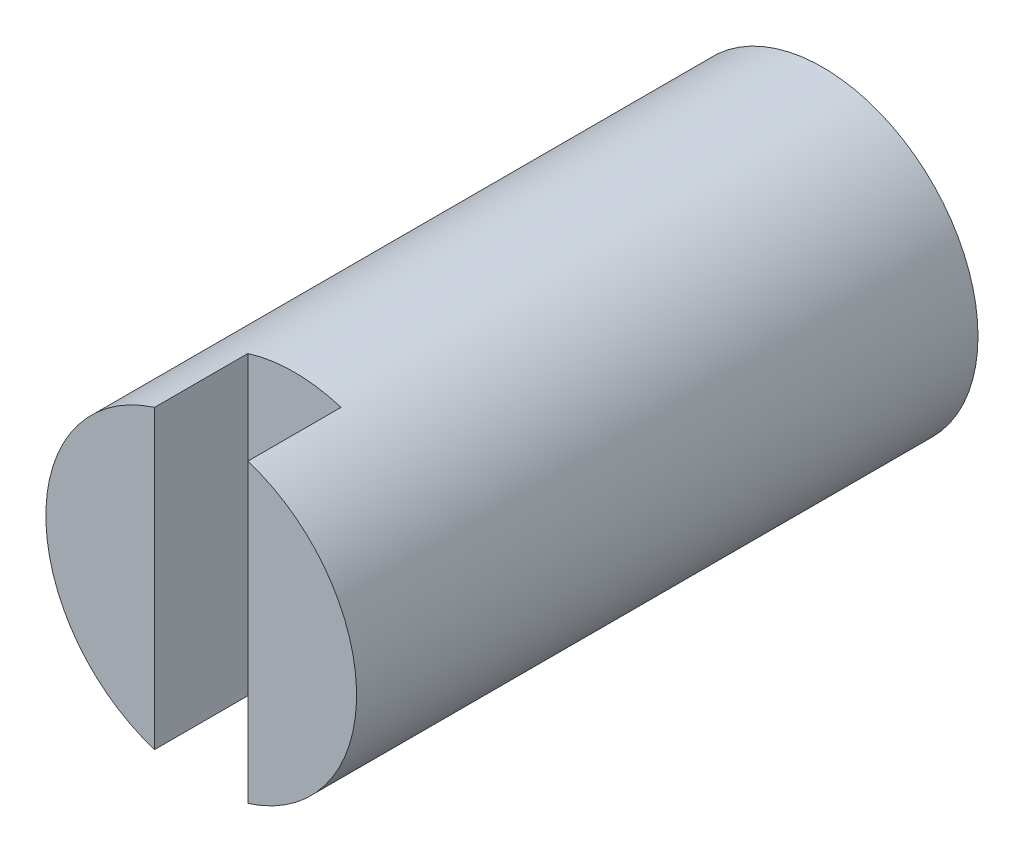
ISO-10303-21;
HEADER;
FILE_DESCRIPTION(('STEP AP214'),'2;1');
FILE_NAME('part.step','',(''),(''),'','','');
FILE_SCHEMA(('AUTOMOTIVE_DESIGN { 1 0 10303 214 1 1 1 1 }'));
ENDSEC;
DATA;
#1=APPLICATION_CONTEXT('core data for automotive mechanical design processes');
#2=APPLICATION_PROTOCOL_DEFINITION('international standard','automotive_design',2000,#1);
#3=PRODUCT_CONTEXT('',#1,'mechanical');
#4=PRODUCT('Part','Part','',(#3));
#5=PRODUCT_RELATED_PRODUCT_CATEGORY('part','',(#4));
#6=PRODUCT_DEFINITION_FORMATION('','',#4);
#7=PRODUCT_DEFINITION_CONTEXT('part definition',#1,'design');
#8=PRODUCT_DEFINITION('design','',#6,#7);
#9=PRODUCT_DEFINITION_SHAPE('','',#8);
#10=(LENGTH_UNIT() NAMED_UNIT(*) SI_UNIT(.MILLI.,.METRE.));
#11=(NAMED_UNIT(*) PLANE_ANGLE_UNIT() SI_UNIT($,.RADIAN.));
#12=(NAMED_UNIT(*) SI_UNIT($,.STERADIAN.) SOLID_ANGLE_UNIT());
#13=UNCERTAINTY_MEASURE_WITH_UNIT(LENGTH_MEASURE(1.E-05),#10,'distance_accuracy_value','');
#14=(GEOMETRIC_REPRESENTATION_CONTEXT(3) GLOBAL_UNCERTAINTY_ASSIGNED_CONTEXT((#13)) GLOBAL_UNIT_ASSIGNED_CONTEXT((#10,
#11,#12)) REPRESENTATION_CONTEXT('',''));
#15=CARTESIAN_POINT('',(0.,0.,0.));
#16=DIRECTION('',(0.,0.,1.));
#17=DIRECTION('',(1.,0.,0.));
#18=AXIS2_PLACEMENT_3D('',#15,#16,#17);
#19=CARTESIAN_POINT('',(0.,0.,8.));
#20=DIRECTION('',(0.,0.,1.));
#21=DIRECTION('',(1.,0.,0.));
#22=AXIS2_PLACEMENT_3D('',#19,#20,#21);
#23=PLANE('',#22);
#24=DIRECTION('',(0.,-1.,0.));
#25=VECTOR('',#24,1.);
#26=CARTESIAN_POINT('',(-0.599999999999999,0.,8.));
#27=LINE('',#26,#25);
#28=CARTESIAN_POINT('',(-0.6,1.90787840283389,8.));
#29=VERTEX_POINT('',#28);
#30=CARTESIAN_POINT('',(-0.599999999999999,-1.90787840283389,8.));
#31=VERTEX_POINT('',#30);
#32=EDGE_CURVE('E80',#29,#31,#27,.T.);
#33=ORIENTED_EDGE('',*,*,#32,.F.);
#34=CARTESIAN_POINT('',(0.,0.,8.));
#35=DIRECTION('',(0.,0.,1.));
#36=DIRECTION('',(1.,0.,0.));
#37=AXIS2_PLACEMENT_3D('',#34,#35,#36);
#38=CIRCLE('',#37,2.);
#39=EDGE_CURVE('E81',#29,#31,#38,.T.);
#40=ORIENTED_EDGE('',*,*,#39,.T.);
#41=EDGE_LOOP('',(#33,#40));
#42=FACE_BOUND('',#41,.T.);
#43=ADVANCED_FACE('F33',(#42),#23,.T.);
#44=CARTESIAN_POINT('',(0.,0.,8.));
#45=DIRECTION('',(0.,0.,-1.));
#46=DIRECTION('',(-1.,0.,0.));
#47=AXIS2_PLACEMENT_3D('',#44,#45,#46);
#48=CYLINDRICAL_SURFACE('',#47,2.);
#49=ORIENTED_EDGE('',*,*,#39,.F.);
#50=DIRECTION('',(0.,0.,-1.));
#51=VECTOR('',#50,1.);
#52=CARTESIAN_POINT('',(-0.6,1.90787840283389,8.));
#53=LINE('',#52,#51);
#54=CARTESIAN_POINT('',(-0.6,1.90787840283389,6.8));
#55=VERTEX_POINT('',#54);
#56=EDGE_CURVE('E96',#29,#55,#53,.T.);
#57=ORIENTED_EDGE('',*,*,#56,.T.);
#58=CARTESIAN_POINT('',(0.,0.,6.8));
#59=DIRECTION('',(0.,0.,1.));
#60=DIRECTION('',(1.,0.,0.));
#61=AXIS2_PLACEMENT_3D('',#58,#59,#60);
#62=CIRCLE('',#61,2.);
#63=CARTESIAN_POINT('',(0.6,1.90787840283389,6.8));
#64=VERTEX_POINT('',#63);
#65=EDGE_CURVE('E11',#64,#55,#62,.T.);
#66=ORIENTED_EDGE('',*,*,#65,.F.);
#67=DIRECTION('',(0.,0.,-1.));
#68=VECTOR('',#67,1.);
#69=CARTESIAN_POINT('',(0.6,1.90787840283389,8.));
#70=LINE('',#69,#68);
#71=CARTESIAN_POINT('',(0.6,1.90787840283389,8.));
#72=VERTEX_POINT('',#71);
#73=EDGE_CURVE('E75',#64,#72,#70,.F.);
#74=ORIENTED_EDGE('',*,*,#73,.T.);
#75=CARTESIAN_POINT('',(0.6,-1.90787840283389,8.));
#76=VERTEX_POINT('',#75);
#77=EDGE_CURVE('E87',#76,#72,#38,.T.);
#78=ORIENTED_EDGE('',*,*,#77,.F.);
#79=DIRECTION('',(0.,0.,-1.));
#80=VECTOR('',#79,1.);
#81=CARTESIAN_POINT('',(0.6,-1.90787840283389,8.));
#82=LINE('',#81,#80);
#83=CARTESIAN_POINT('',(0.6,-1.90787840283389,6.8));
#84=VERTEX_POINT('',#83);
#85=EDGE_CURVE('E48',#76,#84,#82,.T.);
#86=ORIENTED_EDGE('',*,*,#85,.T.);
#87=CARTESIAN_POINT('',(-0.599999999999999,-1.90787840283389,6.8));
#88=VERTEX_POINT('',#87);
#89=EDGE_CURVE('E37',#88,#84,#62,.T.);
#90=ORIENTED_EDGE('',*,*,#89,.F.);
#91=DIRECTION('',(0.,0.,-1.));
#92=VECTOR('',#91,1.);
#93=CARTESIAN_POINT('',(-0.599999999999999,-1.90787840283389,8.));
#94=LINE('',#93,#92);
#95=EDGE_CURVE('E56',#88,#31,#94,.F.);
#96=ORIENTED_EDGE('',*,*,#95,.T.);
#97=EDGE_LOOP('',(#49,#57,#66,#74,#78,#86,#90,#96));
#98=FACE_BOUND('',#97,.T.);
#99=CARTESIAN_POINT('',(0.,0.,0.));
#100=DIRECTION('',(0.,0.,1.));
#101=DIRECTION('',(1.,0.,0.));
#102=AXIS2_PLACEMENT_3D('',#99,#100,#101);
#103=CIRCLE('',#102,2.);
#104=CARTESIAN_POINT('',(2.,0.,0.));
#105=VERTEX_POINT('',#104);
#106=EDGE_CURVE('E92',#105,#105,#103,.T.);
#107=ORIENTED_EDGE('',*,*,#106,.T.);
#108=EDGE_LOOP('',(#107));
#109=FACE_BOUND('',#108,.T.);
#110=ADVANCED_FACE('F35',(#98,#109),#48,.T.);
#111=DIRECTION('',(0.,1.,0.));
#112=VECTOR('',#111,1.);
#113=CARTESIAN_POINT('',(0.6,0.,8.));
#114=LINE('',#113,#112);
#115=EDGE_CURVE('E72',#76,#72,#114,.T.);
#116=ORIENTED_EDGE('',*,*,#115,.F.);
#117=ORIENTED_EDGE('',*,*,#77,.T.);
#118=EDGE_LOOP('',(#116,#117));
#119=FACE_BOUND('',#118,.T.);
#120=ADVANCED_FACE('F91',(#119),#23,.T.);
#121=CARTESIAN_POINT('',(0.,0.,0.));
#122=DIRECTION('',(0.,0.,1.));
#123=DIRECTION('',(1.,0.,0.));
#124=AXIS2_PLACEMENT_3D('',#121,#122,#123);
#125=PLANE('',#124);
#126=ORIENTED_EDGE('',*,*,#106,.F.);
#127=EDGE_LOOP('',(#126));
#128=FACE_BOUND('',#127,.T.);
#129=ADVANCED_FACE('F115',(#128),#125,.F.);
#130=CARTESIAN_POINT('',(-0.599999999999999,-2.20900076277647,6.8));
#131=DIRECTION('',(0.,0.,1.));
#132=DIRECTION('',(1.,0.,0.));
#133=AXIS2_PLACEMENT_3D('',#130,#131,#132);
#134=PLANE('',#133);
#135=ORIENTED_EDGE('',*,*,#65,.T.);
#136=DIRECTION('',(0.,-1.,0.));
#137=VECTOR('',#136,1.);
#138=CARTESIAN_POINT('',(-0.6,2.10526315789477,6.8));
#139=LINE('',#138,#137);
#140=EDGE_CURVE('E103',#55,#88,#139,.T.);
#141=ORIENTED_EDGE('',*,*,#140,.T.);
#142=ORIENTED_EDGE('',*,*,#89,.T.);
#143=DIRECTION('',(0.,1.,0.));
#144=VECTOR('',#143,1.);
#145=CARTESIAN_POINT('',(0.6,2.10526315789477,6.8));
#146=LINE('',#145,#144);
#147=EDGE_CURVE('E89',#84,#64,#146,.T.);
#148=ORIENTED_EDGE('',*,*,#147,.T.);
#149=EDGE_LOOP('',(#135,#141,#142,#148));
#150=FACE_BOUND('',#149,.T.);
#151=ADVANCED_FACE('F102',(#150),#134,.T.);
#152=CARTESIAN_POINT('',(-0.6,2.10526315789477,6.8));
#153=DIRECTION('',(-1.,0.,0.));
#154=DIRECTION('',(0.,-1.,0.));
#155=AXIS2_PLACEMENT_3D('',#152,#153,#154);
#156=PLANE('',#155);
#157=ORIENTED_EDGE('',*,*,#32,.T.);
#158=ORIENTED_EDGE('',*,*,#95,.F.);
#159=ORIENTED_EDGE('',*,*,#140,.F.);
#160=ORIENTED_EDGE('',*,*,#56,.F.);
#161=EDGE_LOOP('',(#157,#158,#159,#160));
#162=FACE_BOUND('',#161,.T.);
#163=ADVANCED_FACE('F107',(#162),#156,.F.);
#164=CARTESIAN_POINT('',(0.6,2.10526315789477,6.8));
#165=DIRECTION('',(1.,0.,0.));
#166=DIRECTION('',(0.,0.,-1.));
#167=AXIS2_PLACEMENT_3D('',#164,#165,#166);
#168=PLANE('',#167);
#169=ORIENTED_EDGE('',*,*,#115,.T.);
#170=ORIENTED_EDGE('',*,*,#73,.F.);
#171=ORIENTED_EDGE('',*,*,#147,.F.);
#172=ORIENTED_EDGE('',*,*,#85,.F.);
#173=EDGE_LOOP('',(#169,#170,#171,#172));
#174=FACE_BOUND('',#173,.T.);
#175=ADVANCED_FACE('F74',(#174),#168,.F.);
#176=CLOSED_SHELL('',(#43,#110,#120,#129,#151,#163,#175));
#177=MANIFOLD_SOLID_BREP('B2',#176);
#178=ADVANCED_BREP_SHAPE_REPRESENTATION('',(#18,#177),#14);
#179=SHAPE_DEFINITION_REPRESENTATION(#9,#178);
ENDSEC;
END-ISO-10303-21;
